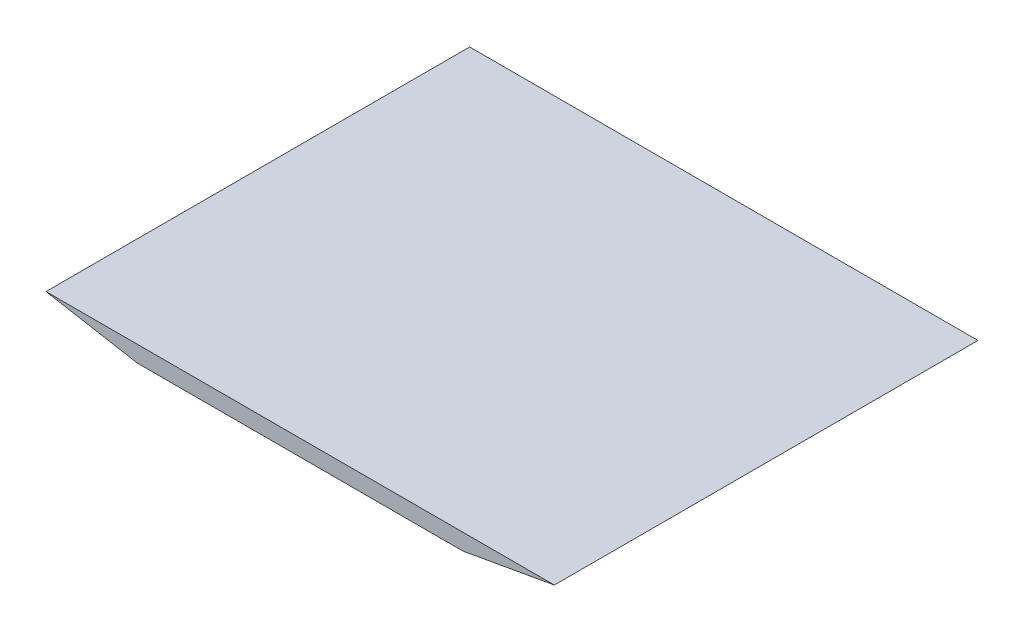
ISO-10303-21;
HEADER;
FILE_DESCRIPTION(('STEP AP214'),'2;1');
FILE_NAME('part.step','',(''),(''),'','','');
FILE_SCHEMA(('AUTOMOTIVE_DESIGN { 1 0 10303 214 1 1 1 1 }'));
ENDSEC;
DATA;
#1=APPLICATION_CONTEXT('core data for automotive mechanical design processes');
#2=APPLICATION_PROTOCOL_DEFINITION('international standard','automotive_design',2000,#1);
#3=PRODUCT_CONTEXT('',#1,'mechanical');
#4=PRODUCT('Part','Part','',(#3));
#5=PRODUCT_RELATED_PRODUCT_CATEGORY('part','',(#4));
#6=PRODUCT_DEFINITION_FORMATION('','',#4);
#7=PRODUCT_DEFINITION_CONTEXT('part definition',#1,'design');
#8=PRODUCT_DEFINITION('design','',#6,#7);
#9=PRODUCT_DEFINITION_SHAPE('','',#8);
#10=(LENGTH_UNIT() NAMED_UNIT(*) SI_UNIT(.MILLI.,.METRE.));
#11=(NAMED_UNIT(*) PLANE_ANGLE_UNIT() SI_UNIT($,.RADIAN.));
#12=(NAMED_UNIT(*) SI_UNIT($,.STERADIAN.) SOLID_ANGLE_UNIT());
#13=UNCERTAINTY_MEASURE_WITH_UNIT(LENGTH_MEASURE(1.E-05),#10,'distance_accuracy_value','');
#14=(GEOMETRIC_REPRESENTATION_CONTEXT(3) GLOBAL_UNCERTAINTY_ASSIGNED_CONTEXT((#13)) GLOBAL_UNIT_ASSIGNED_CONTEXT((#10,
#11,#12)) REPRESENTATION_CONTEXT('',''));
#15=CARTESIAN_POINT('',(0.,0.,0.));
#16=DIRECTION('',(0.,0.,1.));
#17=DIRECTION('',(1.,0.,0.));
#18=AXIS2_PLACEMENT_3D('',#15,#16,#17);
#19=CARTESIAN_POINT('',(28.,-5.00000000000001,130.));
#20=DIRECTION('',(0.175790638483658,0.984427575508482,0.));
#21=DIRECTION('',(-0.984427575508482,0.175790638483658,0.));
#22=AXIS2_PLACEMENT_3D('',#19,#20,#21);
#23=PLANE('',#22);
#24=DIRECTION('',(0.984427575508482,-0.175790638483658,0.));
#25=VECTOR('',#24,1.);
#26=CARTESIAN_POINT('',(28.,-5.00000000000001,0.));
#27=LINE('',#26,#25);
#28=CARTESIAN_POINT('',(0.,0.,0.));
#29=VERTEX_POINT('',#28);
#30=CARTESIAN_POINT('',(28.,-5.00000000000001,0.));
#31=VERTEX_POINT('',#30);
#32=EDGE_CURVE('E107',#29,#31,#27,.T.);
#33=ORIENTED_EDGE('',*,*,#32,.T.);
#34=DIRECTION('',(0.,0.,-1.));
#35=VECTOR('',#34,1.);
#36=CARTESIAN_POINT('',(28.,-5.00000000000001,130.));
#37=LINE('',#36,#35);
#38=CARTESIAN_POINT('',(28.,-5.00000000000001,130.));
#39=VERTEX_POINT('',#38);
#40=EDGE_CURVE('E11',#39,#31,#37,.T.);
#41=ORIENTED_EDGE('',*,*,#40,.F.);
#42=DIRECTION('',(0.984427575508482,-0.175790638483658,0.));
#43=VECTOR('',#42,1.);
#44=CARTESIAN_POINT('',(28.,-5.00000000000001,130.));
#45=LINE('',#44,#43);
#46=CARTESIAN_POINT('',(0.,0.,130.));
#47=VERTEX_POINT('',#46);
#48=EDGE_CURVE('E91',#47,#39,#45,.T.);
#49=ORIENTED_EDGE('',*,*,#48,.F.);
#50=DIRECTION('',(0.,0.,-1.));
#51=VECTOR('',#50,1.);
#52=CARTESIAN_POINT('',(0.,0.,130.));
#53=LINE('',#52,#51);
#54=EDGE_CURVE('E103',#47,#29,#53,.T.);
#55=ORIENTED_EDGE('',*,*,#54,.T.);
#56=EDGE_LOOP('',(#33,#41,#49,#55));
#57=FACE_BOUND('',#56,.T.);
#58=ADVANCED_FACE('F39',(#57),#23,.F.);
#59=CARTESIAN_POINT('',(128.,-5.,130.));
#60=DIRECTION('',(0.,1.,0.));
#61=DIRECTION('',(-1.,0.,0.));
#62=AXIS2_PLACEMENT_3D('',#59,#60,#61);
#63=PLANE('',#62);
#64=DIRECTION('',(1.,0.,0.));
#65=VECTOR('',#64,1.);
#66=CARTESIAN_POINT('',(128.,-5.,0.));
#67=LINE('',#66,#65);
#68=CARTESIAN_POINT('',(128.,-5.,0.));
#69=VERTEX_POINT('',#68);
#70=EDGE_CURVE('E96',#31,#69,#67,.T.);
#71=ORIENTED_EDGE('',*,*,#70,.T.);
#72=DIRECTION('',(0.,0.,-1.));
#73=VECTOR('',#72,1.);
#74=CARTESIAN_POINT('',(128.,-5.,130.));
#75=LINE('',#74,#73);
#76=CARTESIAN_POINT('',(128.,-5.,130.));
#77=VERTEX_POINT('',#76);
#78=EDGE_CURVE('E48',#77,#69,#75,.T.);
#79=ORIENTED_EDGE('',*,*,#78,.F.);
#80=DIRECTION('',(1.,0.,0.));
#81=VECTOR('',#80,1.);
#82=CARTESIAN_POINT('',(128.,-5.,130.));
#83=LINE('',#82,#81);
#84=EDGE_CURVE('E86',#39,#77,#83,.T.);
#85=ORIENTED_EDGE('',*,*,#84,.F.);
#86=ORIENTED_EDGE('',*,*,#40,.T.);
#87=EDGE_LOOP('',(#71,#79,#85,#86));
#88=FACE_BOUND('',#87,.T.);
#89=ADVANCED_FACE('F95',(#88),#63,.F.);
#90=CARTESIAN_POINT('',(156.,0.,130.));
#91=DIRECTION('',(-0.175790638483658,0.984427575508482,0.));
#92=DIRECTION('',(-0.984427575508482,-0.175790638483658,0.));
#93=AXIS2_PLACEMENT_3D('',#90,#91,#92);
#94=PLANE('',#93);
#95=DIRECTION('',(0.984427575508482,0.175790638483658,0.));
#96=VECTOR('',#95,1.);
#97=CARTESIAN_POINT('',(156.,0.,0.));
#98=LINE('',#97,#96);
#99=CARTESIAN_POINT('',(156.,0.,0.));
#100=VERTEX_POINT('',#99);
#101=EDGE_CURVE('E73',#69,#100,#98,.T.);
#102=ORIENTED_EDGE('',*,*,#101,.T.);
#103=DIRECTION('',(0.,0.,-1.));
#104=VECTOR('',#103,1.);
#105=CARTESIAN_POINT('',(156.,0.,130.));
#106=LINE('',#105,#104);
#107=CARTESIAN_POINT('',(156.,0.,130.));
#108=VERTEX_POINT('',#107);
#109=EDGE_CURVE('E98',#108,#100,#106,.T.);
#110=ORIENTED_EDGE('',*,*,#109,.F.);
#111=DIRECTION('',(0.984427575508482,0.175790638483658,0.));
#112=VECTOR('',#111,1.);
#113=CARTESIAN_POINT('',(156.,0.,130.));
#114=LINE('',#113,#112);
#115=EDGE_CURVE('E89',#77,#108,#114,.T.);
#116=ORIENTED_EDGE('',*,*,#115,.F.);
#117=ORIENTED_EDGE('',*,*,#78,.T.);
#118=EDGE_LOOP('',(#102,#110,#116,#117));
#119=FACE_BOUND('',#118,.T.);
#120=ADVANCED_FACE('F99',(#119),#94,.F.);
#121=CARTESIAN_POINT('',(0.,0.,130.));
#122=DIRECTION('',(0.,-1.,0.));
#123=DIRECTION('',(0.,0.,-1.));
#124=AXIS2_PLACEMENT_3D('',#121,#122,#123);
#125=PLANE('',#124);
#126=DIRECTION('',(-1.,0.,0.));
#127=VECTOR('',#126,1.);
#128=CARTESIAN_POINT('',(0.,0.,0.));
#129=LINE('',#128,#127);
#130=EDGE_CURVE('E79',#100,#29,#129,.T.);
#131=ORIENTED_EDGE('',*,*,#130,.T.);
#132=ORIENTED_EDGE('',*,*,#54,.F.);
#133=DIRECTION('',(-1.,0.,0.));
#134=VECTOR('',#133,1.);
#135=CARTESIAN_POINT('',(0.,0.,130.));
#136=LINE('',#135,#134);
#137=EDGE_CURVE('E56',#108,#47,#136,.T.);
#138=ORIENTED_EDGE('',*,*,#137,.F.);
#139=ORIENTED_EDGE('',*,*,#109,.T.);
#140=EDGE_LOOP('',(#131,#132,#138,#139));
#141=FACE_BOUND('',#140,.T.);
#142=ADVANCED_FACE('F120',(#141),#125,.F.);
#143=CARTESIAN_POINT('',(0.,0.,130.));
#144=DIRECTION('',(0.,0.,1.));
#145=DIRECTION('',(1.,0.,0.));
#146=AXIS2_PLACEMENT_3D('',#143,#144,#145);
#147=PLANE('',#146);
#148=ORIENTED_EDGE('',*,*,#48,.T.);
#149=ORIENTED_EDGE('',*,*,#84,.T.);
#150=ORIENTED_EDGE('',*,*,#115,.T.);
#151=ORIENTED_EDGE('',*,*,#137,.T.);
#152=EDGE_LOOP('',(#148,#149,#150,#151));
#153=FACE_BOUND('',#152,.T.);
#154=ADVANCED_FACE('F87',(#153),#147,.T.);
#155=CARTESIAN_POINT('',(0.,0.,0.));
#156=DIRECTION('',(0.,0.,1.));
#157=DIRECTION('',(1.,0.,0.));
#158=AXIS2_PLACEMENT_3D('',#155,#156,#157);
#159=PLANE('',#158);
#160=ORIENTED_EDGE('',*,*,#32,.F.);
#161=ORIENTED_EDGE('',*,*,#130,.F.);
#162=ORIENTED_EDGE('',*,*,#101,.F.);
#163=ORIENTED_EDGE('',*,*,#70,.F.);
#164=EDGE_LOOP('',(#160,#161,#162,#163));
#165=FACE_BOUND('',#164,.T.);
#166=ADVANCED_FACE('F123',(#165),#159,.F.);
#167=CLOSED_SHELL('',(#58,#89,#120,#142,#154,#166));
#168=MANIFOLD_SOLID_BREP('B2',#167);
#169=ADVANCED_BREP_SHAPE_REPRESENTATION('',(#18,#168),#14);
#170=SHAPE_DEFINITION_REPRESENTATION(#9,#169);
ENDSEC;
END-ISO-10303-21;
